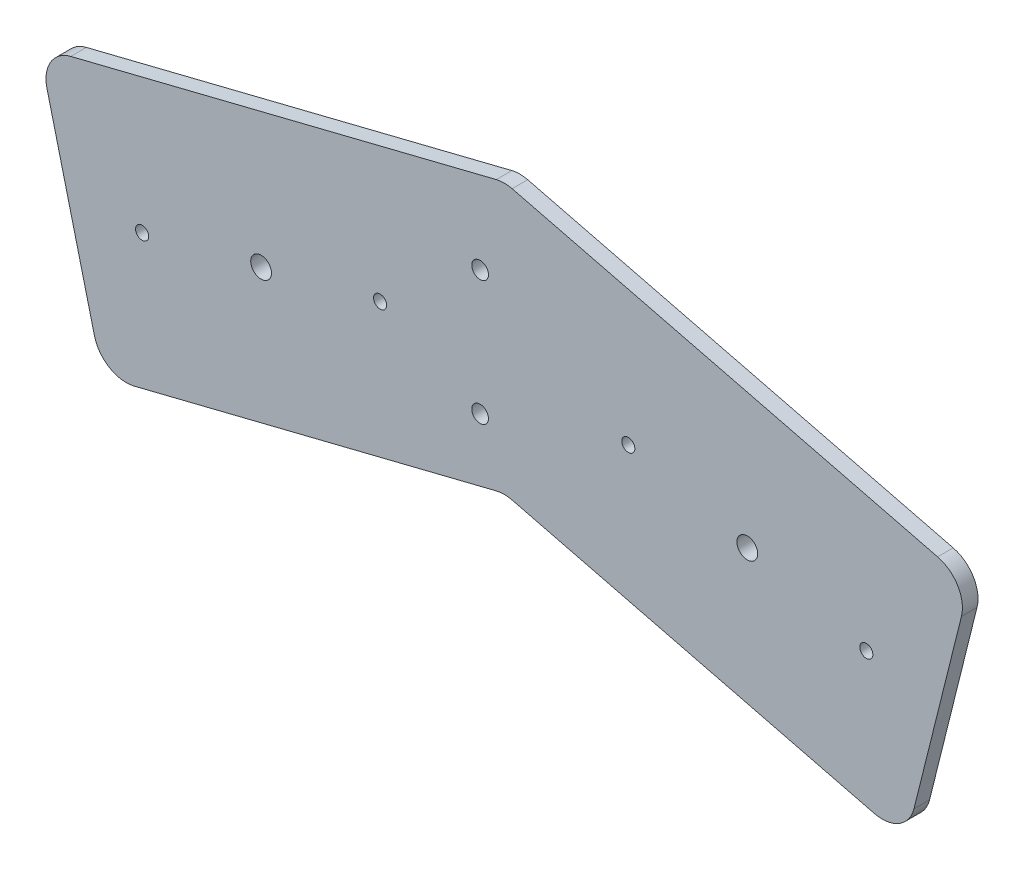
ISO-10303-21;
HEADER;
FILE_DESCRIPTION(('STEP AP214'),'2;1');
FILE_NAME('part.step','',(''),(''),'','','');
FILE_SCHEMA(('AUTOMOTIVE_DESIGN { 1 0 10303 214 1 1 1 1 }'));
ENDSEC;
DATA;
#1=APPLICATION_CONTEXT('core data for automotive mechanical design processes');
#2=APPLICATION_PROTOCOL_DEFINITION('international standard','automotive_design',2000,#1);
#3=PRODUCT_CONTEXT('',#1,'mechanical');
#4=PRODUCT('Part','Part','',(#3));
#5=PRODUCT_RELATED_PRODUCT_CATEGORY('part','',(#4));
#6=PRODUCT_DEFINITION_FORMATION('','',#4);
#7=PRODUCT_DEFINITION_CONTEXT('part definition',#1,'design');
#8=PRODUCT_DEFINITION('design','',#6,#7);
#9=PRODUCT_DEFINITION_SHAPE('','',#8);
#10=(LENGTH_UNIT() NAMED_UNIT(*) SI_UNIT(.MILLI.,.METRE.));
#11=(NAMED_UNIT(*) PLANE_ANGLE_UNIT() SI_UNIT($,.RADIAN.));
#12=(NAMED_UNIT(*) SI_UNIT($,.STERADIAN.) SOLID_ANGLE_UNIT());
#13=UNCERTAINTY_MEASURE_WITH_UNIT(LENGTH_MEASURE(1.E-05),#10,'distance_accuracy_value','');
#14=(GEOMETRIC_REPRESENTATION_CONTEXT(3) GLOBAL_UNCERTAINTY_ASSIGNED_CONTEXT((#13)) GLOBAL_UNIT_ASSIGNED_CONTEXT((#10,
#11,#12)) REPRESENTATION_CONTEXT('',''));
#15=CARTESIAN_POINT('',(0.,0.,0.));
#16=DIRECTION('',(0.,0.,1.));
#17=DIRECTION('',(1.,0.,0.));
#18=AXIS2_PLACEMENT_3D('',#15,#16,#17);
#19=CARTESIAN_POINT('',(0.,-3.86480111006213,-4.7625));
#20=DIRECTION('',(0.,0.,-1.));
#21=DIRECTION('',(-1.,0.,0.));
#22=AXIS2_PLACEMENT_3D('',#19,#20,#21);
#23=PLANE('',#22);
#24=CARTESIAN_POINT('',(-7.366,-20.5695602345621,-4.7625));
#25=DIRECTION('',(0.,0.,1.));
#26=DIRECTION('',(1.,0.,0.));
#27=AXIS2_PLACEMENT_3D('',#24,#25,#26);
#28=CIRCLE('',#27,2.5527);
#29=CARTESIAN_POINT('',(-4.8133,-20.5695602345621,-4.7625));
#30=VERTEX_POINT('',#29);
#31=EDGE_CURVE('E494',#30,#30,#28,.T.);
#32=ORIENTED_EDGE('',*,*,#31,.T.);
#33=EDGE_LOOP('',(#32));
#34=FACE_BOUND('',#33,.T.);
#35=CARTESIAN_POINT('',(-7.366,-58.6695602345621,-4.7625));
#36=DIRECTION('',(0.,0.,1.));
#37=DIRECTION('',(1.,0.,0.));
#38=AXIS2_PLACEMENT_3D('',#35,#36,#37);
#39=CIRCLE('',#38,2.5527);
#40=CARTESIAN_POINT('',(-4.8133,-58.6695602345621,-4.7625));
#41=VERTEX_POINT('',#40);
#42=EDGE_CURVE('E502',#41,#41,#39,.T.);
#43=ORIENTED_EDGE('',*,*,#42,.T.);
#44=EDGE_LOOP('',(#43));
#45=FACE_BOUND('',#44,.T.);
#46=CARTESIAN_POINT('',(-110.721225758861,-62.3891120813645,-4.7625));
#47=DIRECTION('',(0.,0.,1.));
#48=DIRECTION('',(1.,0.,0.));
#49=AXIS2_PLACEMENT_3D('',#46,#47,#48);
#50=CIRCLE('',#49,2.);
#51=CARTESIAN_POINT('',(-108.721225758861,-62.3891120813645,-4.7625));
#52=VERTEX_POINT('',#51);
#53=EDGE_CURVE('E508',#52,#52,#50,.T.);
#54=ORIENTED_EDGE('',*,*,#53,.T.);
#55=EDGE_LOOP('',(#54));
#56=FACE_BOUND('',#55,.T.);
#57=CARTESIAN_POINT('',(-37.9490462881614,-44.2449699113896,-4.7625));
#58=DIRECTION('',(0.,0.,1.));
#59=DIRECTION('',(1.,0.,0.));
#60=AXIS2_PLACEMENT_3D('',#57,#58,#59);
#61=CIRCLE('',#60,2.);
#62=CARTESIAN_POINT('',(-35.9490462881614,-44.2449699113896,-4.7625));
#63=VERTEX_POINT('',#62);
#64=EDGE_CURVE('E514',#63,#63,#61,.T.);
#65=ORIENTED_EDGE('',*,*,#64,.T.);
#66=EDGE_LOOP('',(#65));
#67=FACE_BOUND('',#66,.T.);
#68=CARTESIAN_POINT('',(37.9490462881613,-44.2449699113896,-4.7625));
#69=DIRECTION('',(0.,0.,1.));
#70=DIRECTION('',(1.,0.,0.));
#71=AXIS2_PLACEMENT_3D('',#68,#69,#70);
#72=CIRCLE('',#71,2.);
#73=CARTESIAN_POINT('',(39.9490462881613,-44.2449699113896,-4.7625));
#74=VERTEX_POINT('',#73);
#75=EDGE_CURVE('E520',#74,#74,#72,.T.);
#76=ORIENTED_EDGE('',*,*,#75,.T.);
#77=EDGE_LOOP('',(#76));
#78=FACE_BOUND('',#77,.T.);
#79=CARTESIAN_POINT('',(110.721225758861,-62.3891120813644,-4.7625));
#80=DIRECTION('',(0.,0.,1.));
#81=DIRECTION('',(1.,0.,0.));
#82=AXIS2_PLACEMENT_3D('',#79,#80,#81);
#83=CIRCLE('',#82,2.);
#84=CARTESIAN_POINT('',(112.721225758861,-62.3891120813644,-4.7625));
#85=VERTEX_POINT('',#84);
#86=EDGE_CURVE('E526',#85,#85,#83,.T.);
#87=ORIENTED_EDGE('',*,*,#86,.T.);
#88=EDGE_LOOP('',(#87));
#89=FACE_BOUND('',#88,.T.);
#90=CARTESIAN_POINT('',(-74.3351360235113,-53.317040996377,-4.7625));
#91=DIRECTION('',(0.,0.,1.));
#92=DIRECTION('',(1.,0.,0.));
#93=AXIS2_PLACEMENT_3D('',#90,#91,#92);
#94=CIRCLE('',#93,3.175);
#95=CARTESIAN_POINT('',(-71.1601360235113,-53.317040996377,-4.7625));
#96=VERTEX_POINT('',#95);
#97=EDGE_CURVE('E307',#96,#96,#94,.T.);
#98=ORIENTED_EDGE('',*,*,#97,.T.);
#99=EDGE_LOOP('',(#98));
#100=FACE_BOUND('',#99,.T.);
#101=CARTESIAN_POINT('',(0.,-3.86480111006213,-4.7625));
#102=DIRECTION('',(0.,0.,1.));
#103=DIRECTION('',(-1.,0.,0.));
#104=AXIS2_PLACEMENT_3D('',#101,#102,#103);
#105=CIRCLE('',#104,10.);
#106=CARTESIAN_POINT('',(2.41921895599665,5.83815615269784,-4.7625));
#107=VERTEX_POINT('',#106);
#108=CARTESIAN_POINT('',(-2.41921895599664,5.83815615269785,-4.7625));
#109=VERTEX_POINT('',#108);
#110=EDGE_CURVE('E216',#107,#109,#105,.T.);
#111=ORIENTED_EDGE('',*,*,#110,.F.);
#112=DIRECTION('',(-0.970295726275997,0.241921895599664,0.));
#113=VECTOR('',#112,1.);
#114=CARTESIAN_POINT('',(2.41921895599665,5.83815615269784,-4.7625));
#115=LINE('',#114,#113);
#116=CARTESIAN_POINT('',(132.526798161298,-26.6013067253204,-4.7625));
#117=VERTEX_POINT('',#116);
#118=EDGE_CURVE('E157',#117,#107,#115,.T.);
#119=ORIENTED_EDGE('',*,*,#118,.F.);
#120=CARTESIAN_POINT('',(130.107579205301,-36.3042639880803,-4.7625));
#121=DIRECTION('',(0.,0.,1.));
#122=DIRECTION('',(-1.,0.,0.));
#123=AXIS2_PLACEMENT_3D('',#120,#121,#122);
#124=CIRCLE('',#123,9.99999999999998);
#125=CARTESIAN_POINT('',(139.810536468061,-38.7234829440769,-4.7625));
#126=VERTEX_POINT('',#125);
#127=EDGE_CURVE('E141',#126,#117,#124,.T.);
#128=ORIENTED_EDGE('',*,*,#127,.F.);
#129=DIRECTION('',(0.241921895599665,0.970295726275997,0.));
#130=VECTOR('',#129,1.);
#131=CARTESIAN_POINT('',(139.810536468061,-38.7234829440769,-4.7625));
#132=LINE('',#131,#130);
#133=CARTESIAN_POINT('',(125.295222732081,-96.9412265206368,-4.7625));
#134=VERTEX_POINT('',#133);
#135=EDGE_CURVE('E155',#134,#126,#132,.T.);
#136=ORIENTED_EDGE('',*,*,#135,.F.);
#137=CARTESIAN_POINT('',(115.592265469321,-94.5220075646401,-4.7625));
#138=DIRECTION('',(0.,0.,1.));
#139=DIRECTION('',(-1.,0.,0.));
#140=AXIS2_PLACEMENT_3D('',#137,#138,#139);
#141=CIRCLE('',#140,10.);
#142=CARTESIAN_POINT('',(113.173046513324,-104.2249648274,-4.7625));
#143=VERTEX_POINT('',#142);
#144=EDGE_CURVE('E162',#143,#134,#141,.T.);
#145=ORIENTED_EDGE('',*,*,#144,.F.);
#146=DIRECTION('',(0.970295726275997,-0.241921895599664,0.));
#147=VECTOR('',#146,1.);
#148=CARTESIAN_POINT('',(113.173046513324,-104.2249648274,-4.7625));
#149=LINE('',#148,#147);
#150=CARTESIAN_POINT('',(2.41921895599661,-76.610934195294,-4.7625));
#151=VERTEX_POINT('',#150);
#152=EDGE_CURVE('E165',#151,#143,#149,.T.);
#153=ORIENTED_EDGE('',*,*,#152,.F.);
#154=CARTESIAN_POINT('',(0.,-86.3138914580539,-4.7625));
#155=DIRECTION('',(0.,0.,-1.));
#156=DIRECTION('',(1.,0.,0.));
#157=AXIS2_PLACEMENT_3D('',#154,#155,#156);
#158=CIRCLE('',#157,9.99999999999998);
#159=CARTESIAN_POINT('',(-2.41921895599667,-76.610934195294,-4.7625));
#160=VERTEX_POINT('',#159);
#161=EDGE_CURVE('E338',#160,#151,#158,.T.);
#162=ORIENTED_EDGE('',*,*,#161,.F.);
#163=DIRECTION('',(0.970295726275997,0.241921895599665,0.));
#164=VECTOR('',#163,1.);
#165=CARTESIAN_POINT('',(-2.41921895599667,-76.610934195294,-4.7625));
#166=LINE('',#165,#164);
#167=CARTESIAN_POINT('',(-113.173046513325,-104.2249648274,-4.7625));
#168=VERTEX_POINT('',#167);
#169=EDGE_CURVE('E334',#168,#160,#166,.T.);
#170=ORIENTED_EDGE('',*,*,#169,.F.);
#171=CARTESIAN_POINT('',(-115.592265469321,-94.5220075646403,-4.7625));
#172=DIRECTION('',(0.,0.,1.));
#173=DIRECTION('',(-1.,0.,0.));
#174=AXIS2_PLACEMENT_3D('',#171,#172,#173);
#175=CIRCLE('',#174,9.99999999999999);
#176=CARTESIAN_POINT('',(-125.295222732081,-96.9412265206369,-4.7625));
#177=VERTEX_POINT('',#176);
#178=EDGE_CURVE('E330',#177,#168,#175,.T.);
#179=ORIENTED_EDGE('',*,*,#178,.F.);
#180=DIRECTION('',(0.241921895599665,-0.970295726275997,0.));
#181=VECTOR('',#180,1.);
#182=CARTESIAN_POINT('',(-125.295222732081,-96.9412265206369,-4.7625));
#183=LINE('',#182,#181);
#184=CARTESIAN_POINT('',(-139.810536468061,-38.723482944077,-4.7625));
#185=VERTEX_POINT('',#184);
#186=EDGE_CURVE('E326',#185,#177,#183,.T.);
#187=ORIENTED_EDGE('',*,*,#186,.F.);
#188=CARTESIAN_POINT('',(-130.107579205301,-36.3042639880804,-4.7625));
#189=DIRECTION('',(0.,0.,1.));
#190=DIRECTION('',(1.,0.,0.));
#191=AXIS2_PLACEMENT_3D('',#188,#189,#190);
#192=CIRCLE('',#191,10.);
#193=CARTESIAN_POINT('',(-132.526798161298,-26.6013067253204,-4.7625));
#194=VERTEX_POINT('',#193);
#195=EDGE_CURVE('E322',#194,#185,#192,.T.);
#196=ORIENTED_EDGE('',*,*,#195,.F.);
#197=DIRECTION('',(-0.970295726275997,-0.241921895599665,0.));
#198=VECTOR('',#197,1.);
#199=CARTESIAN_POINT('',(-132.526798161298,-26.6013067253204,-4.7625));
#200=LINE('',#199,#198);
#201=EDGE_CURVE('E319',#109,#194,#200,.T.);
#202=ORIENTED_EDGE('',*,*,#201,.F.);
#203=EDGE_LOOP('',(#111,#119,#128,#136,#145,#153,#162,#170,#179,#187,#196,#202));
#204=FACE_BOUND('',#203,.T.);
#205=CARTESIAN_POINT('',(74.3351360235112,-53.317040996377,-4.7625));
#206=DIRECTION('',(0.,0.,1.));
#207=DIRECTION('',(1.,0.,0.));
#208=AXIS2_PLACEMENT_3D('',#205,#206,#207);
#209=CIRCLE('',#208,3.175);
#210=CARTESIAN_POINT('',(77.5101360235112,-53.317040996377,-4.7625));
#211=VERTEX_POINT('',#210);
#212=EDGE_CURVE('E176',#211,#211,#209,.T.);
#213=ORIENTED_EDGE('',*,*,#212,.T.);
#214=EDGE_LOOP('',(#213));
#215=FACE_BOUND('',#214,.T.);
#216=ADVANCED_FACE('F43',(#34,#45,#56,#67,#78,#89,#100,#204,#215),#23,.T.);
#217=CARTESIAN_POINT('',(0.,-3.86480111006213,-4.7625));
#218=DIRECTION('',(0.,0.,1.));
#219=DIRECTION('',(1.,0.,0.));
#220=AXIS2_PLACEMENT_3D('',#217,#218,#219);
#221=CYLINDRICAL_SURFACE('',#220,10.);
#222=CARTESIAN_POINT('',(0.,-3.86480111006213,0.));
#223=DIRECTION('',(0.,0.,1.));
#224=DIRECTION('',(-1.,0.,0.));
#225=AXIS2_PLACEMENT_3D('',#222,#223,#224);
#226=CIRCLE('',#225,10.);
#227=CARTESIAN_POINT('',(2.41921895599665,5.83815615269784,0.));
#228=VERTEX_POINT('',#227);
#229=CARTESIAN_POINT('',(-2.41921895599664,5.83815615269785,0.));
#230=VERTEX_POINT('',#229);
#231=EDGE_CURVE('E171',#228,#230,#226,.T.);
#232=ORIENTED_EDGE('',*,*,#231,.F.);
#233=DIRECTION('',(0.,0.,1.));
#234=VECTOR('',#233,1.);
#235=CARTESIAN_POINT('',(2.41921895599665,5.83815615269784,-4.7625));
#236=LINE('',#235,#234);
#237=EDGE_CURVE('E11',#107,#228,#236,.T.);
#238=ORIENTED_EDGE('',*,*,#237,.F.);
#239=ORIENTED_EDGE('',*,*,#110,.T.);
#240=DIRECTION('',(0.,0.,1.));
#241=VECTOR('',#240,1.);
#242=CARTESIAN_POINT('',(-2.41921895599664,5.83815615269785,-4.7625));
#243=LINE('',#242,#241);
#244=EDGE_CURVE('E47',#109,#230,#243,.T.);
#245=ORIENTED_EDGE('',*,*,#244,.T.);
#246=EDGE_LOOP('',(#232,#238,#239,#245));
#247=FACE_BOUND('',#246,.T.);
#248=ADVANCED_FACE('F45',(#247),#221,.T.);
#249=CARTESIAN_POINT('',(2.41921895599665,5.83815615269784,-4.7625));
#250=DIRECTION('',(0.241921895599664,0.970295726275997,0.));
#251=DIRECTION('',(-0.970295726275997,0.241921895599664,0.));
#252=AXIS2_PLACEMENT_3D('',#249,#250,#251);
#253=PLANE('',#252);
#254=DIRECTION('',(-0.970295726275997,0.241921895599664,0.));
#255=VECTOR('',#254,1.);
#256=CARTESIAN_POINT('',(2.41921895599665,5.83815615269784,0.));
#257=LINE('',#256,#255);
#258=CARTESIAN_POINT('',(132.526798161298,-26.6013067253204,0.));
#259=VERTEX_POINT('',#258);
#260=EDGE_CURVE('E213',#259,#228,#257,.T.);
#261=ORIENTED_EDGE('',*,*,#260,.F.);
#262=DIRECTION('',(0.,0.,1.));
#263=VECTOR('',#262,1.);
#264=CARTESIAN_POINT('',(132.526798161298,-26.6013067253204,-4.7625));
#265=LINE('',#264,#263);
#266=EDGE_CURVE('E54',#117,#259,#265,.T.);
#267=ORIENTED_EDGE('',*,*,#266,.F.);
#268=ORIENTED_EDGE('',*,*,#118,.T.);
#269=ORIENTED_EDGE('',*,*,#237,.T.);
#270=EDGE_LOOP('',(#261,#267,#268,#269));
#271=FACE_BOUND('',#270,.T.);
#272=ADVANCED_FACE('F246',(#271),#253,.T.);
#273=CARTESIAN_POINT('',(130.107579205301,-36.3042639880803,-4.7625));
#274=DIRECTION('',(0.,0.,1.));
#275=DIRECTION('',(1.,0.,0.));
#276=AXIS2_PLACEMENT_3D('',#273,#274,#275);
#277=CYLINDRICAL_SURFACE('',#276,9.99999999999998);
#278=CARTESIAN_POINT('',(130.107579205301,-36.3042639880803,0.));
#279=DIRECTION('',(0.,0.,1.));
#280=DIRECTION('',(-1.,0.,0.));
#281=AXIS2_PLACEMENT_3D('',#278,#279,#280);
#282=CIRCLE('',#281,9.99999999999998);
#283=CARTESIAN_POINT('',(139.810536468061,-38.7234829440769,0.));
#284=VERTEX_POINT('',#283);
#285=EDGE_CURVE('E143',#284,#259,#282,.T.);
#286=ORIENTED_EDGE('',*,*,#285,.F.);
#287=DIRECTION('',(0.,0.,1.));
#288=VECTOR('',#287,1.);
#289=CARTESIAN_POINT('',(139.810536468061,-38.7234829440769,-4.7625));
#290=LINE('',#289,#288);
#291=EDGE_CURVE('E138',#126,#284,#290,.T.);
#292=ORIENTED_EDGE('',*,*,#291,.F.);
#293=ORIENTED_EDGE('',*,*,#127,.T.);
#294=ORIENTED_EDGE('',*,*,#266,.T.);
#295=EDGE_LOOP('',(#286,#292,#293,#294));
#296=FACE_BOUND('',#295,.T.);
#297=ADVANCED_FACE('F140',(#296),#277,.T.);
#298=CARTESIAN_POINT('',(139.810536468061,-38.7234829440769,-4.7625));
#299=DIRECTION('',(0.970295726275997,-0.241921895599665,0.));
#300=DIRECTION('',(0.241921895599665,0.970295726275997,0.));
#301=AXIS2_PLACEMENT_3D('',#298,#299,#300);
#302=PLANE('',#301);
#303=DIRECTION('',(0.241921895599665,0.970295726275997,0.));
#304=VECTOR('',#303,1.);
#305=CARTESIAN_POINT('',(139.810536468061,-38.7234829440769,0.));
#306=LINE('',#305,#304);
#307=CARTESIAN_POINT('',(125.295222732081,-96.9412265206368,0.));
#308=VERTEX_POINT('',#307);
#309=EDGE_CURVE('E208',#308,#284,#306,.T.);
#310=ORIENTED_EDGE('',*,*,#309,.F.);
#311=DIRECTION('',(0.,0.,1.));
#312=VECTOR('',#311,1.);
#313=CARTESIAN_POINT('',(125.295222732081,-96.9412265206368,-4.7625));
#314=LINE('',#313,#312);
#315=EDGE_CURVE('E149',#134,#308,#314,.T.);
#316=ORIENTED_EDGE('',*,*,#315,.F.);
#317=ORIENTED_EDGE('',*,*,#135,.T.);
#318=ORIENTED_EDGE('',*,*,#291,.T.);
#319=EDGE_LOOP('',(#310,#316,#317,#318));
#320=FACE_BOUND('',#319,.T.);
#321=ADVANCED_FACE('F160',(#320),#302,.T.);
#322=CARTESIAN_POINT('',(115.592265469321,-94.5220075646401,-4.7625));
#323=DIRECTION('',(0.,0.,1.));
#324=DIRECTION('',(1.,0.,0.));
#325=AXIS2_PLACEMENT_3D('',#322,#323,#324);
#326=CYLINDRICAL_SURFACE('',#325,10.);
#327=CARTESIAN_POINT('',(115.592265469321,-94.5220075646401,0.));
#328=DIRECTION('',(0.,0.,1.));
#329=DIRECTION('',(-1.,0.,0.));
#330=AXIS2_PLACEMENT_3D('',#327,#328,#329);
#331=CIRCLE('',#330,10.);
#332=CARTESIAN_POINT('',(113.173046513324,-104.2249648274,0.));
#333=VERTEX_POINT('',#332);
#334=EDGE_CURVE('E204',#333,#308,#331,.T.);
#335=ORIENTED_EDGE('',*,*,#334,.F.);
#336=DIRECTION('',(0.,0.,1.));
#337=VECTOR('',#336,1.);
#338=CARTESIAN_POINT('',(113.173046513324,-104.2249648274,-4.7625));
#339=LINE('',#338,#337);
#340=EDGE_CURVE('E222',#143,#333,#339,.T.);
#341=ORIENTED_EDGE('',*,*,#340,.F.);
#342=ORIENTED_EDGE('',*,*,#144,.T.);
#343=ORIENTED_EDGE('',*,*,#315,.T.);
#344=EDGE_LOOP('',(#335,#341,#342,#343));
#345=FACE_BOUND('',#344,.T.);
#346=ADVANCED_FACE('F367',(#345),#326,.T.);
#347=CARTESIAN_POINT('',(113.173046513324,-104.2249648274,-4.7625));
#348=DIRECTION('',(-0.241921895599664,-0.970295726275997,0.));
#349=DIRECTION('',(0.970295726275997,-0.241921895599664,0.));
#350=AXIS2_PLACEMENT_3D('',#347,#348,#349);
#351=PLANE('',#350);
#352=DIRECTION('',(0.970295726275997,-0.241921895599664,0.));
#353=VECTOR('',#352,1.);
#354=CARTESIAN_POINT('',(113.173046513324,-104.2249648274,0.));
#355=LINE('',#354,#353);
#356=CARTESIAN_POINT('',(2.41921895599661,-76.610934195294,0.));
#357=VERTEX_POINT('',#356);
#358=EDGE_CURVE('E200',#357,#333,#355,.T.);
#359=ORIENTED_EDGE('',*,*,#358,.F.);
#360=DIRECTION('',(0.,0.,1.));
#361=VECTOR('',#360,1.);
#362=CARTESIAN_POINT('',(2.41921895599661,-76.610934195294,-4.7625));
#363=LINE('',#362,#361);
#364=EDGE_CURVE('E225',#151,#357,#363,.T.);
#365=ORIENTED_EDGE('',*,*,#364,.F.);
#366=ORIENTED_EDGE('',*,*,#152,.T.);
#367=ORIENTED_EDGE('',*,*,#340,.T.);
#368=EDGE_LOOP('',(#359,#365,#366,#367));
#369=FACE_BOUND('',#368,.T.);
#370=ADVANCED_FACE('F346',(#369),#351,.T.);
#371=CARTESIAN_POINT('',(0.,-86.3138914580539,-4.7625));
#372=DIRECTION('',(0.,0.,1.));
#373=DIRECTION('',(1.,0.,0.));
#374=AXIS2_PLACEMENT_3D('',#371,#372,#373);
#375=CYLINDRICAL_SURFACE('',#374,9.99999999999998);
#376=CARTESIAN_POINT('',(0.,-86.3138914580539,0.));
#377=DIRECTION('',(0.,0.,-1.));
#378=DIRECTION('',(1.,0.,0.));
#379=AXIS2_PLACEMENT_3D('',#376,#377,#378);
#380=CIRCLE('',#379,9.99999999999998);
#381=CARTESIAN_POINT('',(-2.41921895599667,-76.610934195294,0.));
#382=VERTEX_POINT('',#381);
#383=EDGE_CURVE('E196',#382,#357,#380,.T.);
#384=ORIENTED_EDGE('',*,*,#383,.F.);
#385=DIRECTION('',(0.,0.,1.));
#386=VECTOR('',#385,1.);
#387=CARTESIAN_POINT('',(-2.41921895599667,-76.610934195294,-4.7625));
#388=LINE('',#387,#386);
#389=EDGE_CURVE('E228',#160,#382,#388,.T.);
#390=ORIENTED_EDGE('',*,*,#389,.F.);
#391=ORIENTED_EDGE('',*,*,#161,.T.);
#392=ORIENTED_EDGE('',*,*,#364,.T.);
#393=EDGE_LOOP('',(#384,#390,#391,#392));
#394=FACE_BOUND('',#393,.T.);
#395=ADVANCED_FACE('F352',(#394),#375,.F.);
#396=CARTESIAN_POINT('',(-2.41921895599667,-76.610934195294,-4.7625));
#397=DIRECTION('',(0.241921895599665,-0.970295726275997,0.));
#398=DIRECTION('',(0.970295726275997,0.241921895599665,0.));
#399=AXIS2_PLACEMENT_3D('',#396,#397,#398);
#400=PLANE('',#399);
#401=DIRECTION('',(0.970295726275997,0.241921895599665,0.));
#402=VECTOR('',#401,1.);
#403=CARTESIAN_POINT('',(-2.41921895599667,-76.610934195294,0.));
#404=LINE('',#403,#402);
#405=CARTESIAN_POINT('',(-113.173046513325,-104.2249648274,0.));
#406=VERTEX_POINT('',#405);
#407=EDGE_CURVE('E192',#406,#382,#404,.T.);
#408=ORIENTED_EDGE('',*,*,#407,.F.);
#409=DIRECTION('',(0.,0.,1.));
#410=VECTOR('',#409,1.);
#411=CARTESIAN_POINT('',(-113.173046513325,-104.2249648274,-4.7625));
#412=LINE('',#411,#410);
#413=EDGE_CURVE('E231',#168,#406,#412,.T.);
#414=ORIENTED_EDGE('',*,*,#413,.F.);
#415=ORIENTED_EDGE('',*,*,#169,.T.);
#416=ORIENTED_EDGE('',*,*,#389,.T.);
#417=EDGE_LOOP('',(#408,#414,#415,#416));
#418=FACE_BOUND('',#417,.T.);
#419=ADVANCED_FACE('F355',(#418),#400,.T.);
#420=CARTESIAN_POINT('',(-115.592265469321,-94.5220075646403,-4.7625));
#421=DIRECTION('',(0.,0.,1.));
#422=DIRECTION('',(1.,0.,0.));
#423=AXIS2_PLACEMENT_3D('',#420,#421,#422);
#424=CYLINDRICAL_SURFACE('',#423,9.99999999999999);
#425=CARTESIAN_POINT('',(-115.592265469321,-94.5220075646403,0.));
#426=DIRECTION('',(0.,0.,1.));
#427=DIRECTION('',(-1.,0.,0.));
#428=AXIS2_PLACEMENT_3D('',#425,#426,#427);
#429=CIRCLE('',#428,9.99999999999999);
#430=CARTESIAN_POINT('',(-125.295222732081,-96.9412265206369,0.));
#431=VERTEX_POINT('',#430);
#432=EDGE_CURVE('E188',#431,#406,#429,.T.);
#433=ORIENTED_EDGE('',*,*,#432,.F.);
#434=DIRECTION('',(0.,0.,1.));
#435=VECTOR('',#434,1.);
#436=CARTESIAN_POINT('',(-125.295222732081,-96.9412265206369,-4.7625));
#437=LINE('',#436,#435);
#438=EDGE_CURVE('E234',#177,#431,#437,.T.);
#439=ORIENTED_EDGE('',*,*,#438,.F.);
#440=ORIENTED_EDGE('',*,*,#178,.T.);
#441=ORIENTED_EDGE('',*,*,#413,.T.);
#442=EDGE_LOOP('',(#433,#439,#440,#441));
#443=FACE_BOUND('',#442,.T.);
#444=ADVANCED_FACE('F360',(#443),#424,.T.);
#445=CARTESIAN_POINT('',(-125.295222732081,-96.9412265206369,-4.7625));
#446=DIRECTION('',(-0.970295726275997,-0.241921895599665,0.));
#447=DIRECTION('',(0.241921895599665,-0.970295726275997,0.));
#448=AXIS2_PLACEMENT_3D('',#445,#446,#447);
#449=PLANE('',#448);
#450=DIRECTION('',(0.241921895599665,-0.970295726275997,0.));
#451=VECTOR('',#450,1.);
#452=CARTESIAN_POINT('',(-125.295222732081,-96.9412265206369,0.));
#453=LINE('',#452,#451);
#454=CARTESIAN_POINT('',(-139.810536468061,-38.723482944077,0.));
#455=VERTEX_POINT('',#454);
#456=EDGE_CURVE('E184',#455,#431,#453,.T.);
#457=ORIENTED_EDGE('',*,*,#456,.F.);
#458=DIRECTION('',(0.,0.,1.));
#459=VECTOR('',#458,1.);
#460=CARTESIAN_POINT('',(-139.810536468061,-38.723482944077,-4.7625));
#461=LINE('',#460,#459);
#462=EDGE_CURVE('E237',#185,#455,#461,.T.);
#463=ORIENTED_EDGE('',*,*,#462,.F.);
#464=ORIENTED_EDGE('',*,*,#186,.T.);
#465=ORIENTED_EDGE('',*,*,#438,.T.);
#466=EDGE_LOOP('',(#457,#463,#464,#465));
#467=FACE_BOUND('',#466,.T.);
#468=ADVANCED_FACE('F363',(#467),#449,.T.);
#469=CARTESIAN_POINT('',(-130.107579205301,-36.3042639880804,-4.7625));
#470=DIRECTION('',(0.,0.,1.));
#471=DIRECTION('',(1.,0.,0.));
#472=AXIS2_PLACEMENT_3D('',#469,#470,#471);
#473=CYLINDRICAL_SURFACE('',#472,10.);
#474=CARTESIAN_POINT('',(-130.107579205301,-36.3042639880804,0.));
#475=DIRECTION('',(0.,0.,1.));
#476=DIRECTION('',(1.,0.,0.));
#477=AXIS2_PLACEMENT_3D('',#474,#475,#476);
#478=CIRCLE('',#477,10.);
#479=CARTESIAN_POINT('',(-132.526798161298,-26.6013067253204,0.));
#480=VERTEX_POINT('',#479);
#481=EDGE_CURVE('E180',#480,#455,#478,.T.);
#482=ORIENTED_EDGE('',*,*,#481,.F.);
#483=DIRECTION('',(0.,0.,1.));
#484=VECTOR('',#483,1.);
#485=CARTESIAN_POINT('',(-132.526798161298,-26.6013067253204,-4.7625));
#486=LINE('',#485,#484);
#487=EDGE_CURVE('E239',#194,#480,#486,.T.);
#488=ORIENTED_EDGE('',*,*,#487,.F.);
#489=ORIENTED_EDGE('',*,*,#195,.T.);
#490=ORIENTED_EDGE('',*,*,#462,.T.);
#491=EDGE_LOOP('',(#482,#488,#489,#490));
#492=FACE_BOUND('',#491,.T.);
#493=ADVANCED_FACE('F273',(#492),#473,.T.);
#494=CARTESIAN_POINT('',(-132.526798161298,-26.6013067253204,-4.7625));
#495=DIRECTION('',(-0.241921895599665,0.970295726275997,0.));
#496=DIRECTION('',(-0.970295726275997,-0.241921895599665,0.));
#497=AXIS2_PLACEMENT_3D('',#494,#495,#496);
#498=PLANE('',#497);
#499=DIRECTION('',(-0.970295726275997,-0.241921895599665,0.));
#500=VECTOR('',#499,1.);
#501=CARTESIAN_POINT('',(-132.526798161298,-26.6013067253204,0.));
#502=LINE('',#501,#500);
#503=EDGE_CURVE('E175',#230,#480,#502,.T.);
#504=ORIENTED_EDGE('',*,*,#503,.F.);
#505=ORIENTED_EDGE('',*,*,#244,.F.);
#506=ORIENTED_EDGE('',*,*,#201,.T.);
#507=ORIENTED_EDGE('',*,*,#487,.T.);
#508=EDGE_LOOP('',(#504,#505,#506,#507));
#509=FACE_BOUND('',#508,.T.);
#510=ADVANCED_FACE('F243',(#509),#498,.T.);
#511=CARTESIAN_POINT('',(0.,-3.86480111006213,0.));
#512=DIRECTION('',(0.,0.,-1.));
#513=DIRECTION('',(-1.,0.,0.));
#514=AXIS2_PLACEMENT_3D('',#511,#512,#513);
#515=PLANE('',#514);
#516=CARTESIAN_POINT('',(-7.366,-20.5695602345621,0.));
#517=DIRECTION('',(0.,0.,1.));
#518=DIRECTION('',(1.,0.,0.));
#519=AXIS2_PLACEMENT_3D('',#516,#517,#518);
#520=CIRCLE('',#519,2.5527);
#521=CARTESIAN_POINT('',(-4.8133,-20.5695602345621,0.));
#522=VERTEX_POINT('',#521);
#523=EDGE_CURVE('E277',#522,#522,#520,.T.);
#524=ORIENTED_EDGE('',*,*,#523,.F.);
#525=EDGE_LOOP('',(#524));
#526=FACE_BOUND('',#525,.T.);
#527=CARTESIAN_POINT('',(-7.366,-58.6695602345621,0.));
#528=DIRECTION('',(0.,0.,1.));
#529=DIRECTION('',(1.,0.,0.));
#530=AXIS2_PLACEMENT_3D('',#527,#528,#529);
#531=CIRCLE('',#530,2.5527);
#532=CARTESIAN_POINT('',(-4.8133,-58.6695602345621,0.));
#533=VERTEX_POINT('',#532);
#534=EDGE_CURVE('E281',#533,#533,#531,.T.);
#535=ORIENTED_EDGE('',*,*,#534,.F.);
#536=EDGE_LOOP('',(#535));
#537=FACE_BOUND('',#536,.T.);
#538=CARTESIAN_POINT('',(-110.721225758861,-62.3891120813645,0.));
#539=DIRECTION('',(0.,0.,1.));
#540=DIRECTION('',(1.,0.,0.));
#541=AXIS2_PLACEMENT_3D('',#538,#539,#540);
#542=CIRCLE('',#541,2.);
#543=CARTESIAN_POINT('',(-108.721225758861,-62.3891120813645,0.));
#544=VERTEX_POINT('',#543);
#545=EDGE_CURVE('E285',#544,#544,#542,.T.);
#546=ORIENTED_EDGE('',*,*,#545,.F.);
#547=EDGE_LOOP('',(#546));
#548=FACE_BOUND('',#547,.T.);
#549=CARTESIAN_POINT('',(-37.9490462881614,-44.2449699113896,0.));
#550=DIRECTION('',(0.,0.,1.));
#551=DIRECTION('',(1.,0.,0.));
#552=AXIS2_PLACEMENT_3D('',#549,#550,#551);
#553=CIRCLE('',#552,2.);
#554=CARTESIAN_POINT('',(-35.9490462881614,-44.2449699113896,0.));
#555=VERTEX_POINT('',#554);
#556=EDGE_CURVE('E289',#555,#555,#553,.T.);
#557=ORIENTED_EDGE('',*,*,#556,.F.);
#558=EDGE_LOOP('',(#557));
#559=FACE_BOUND('',#558,.T.);
#560=CARTESIAN_POINT('',(37.9490462881613,-44.2449699113896,0.));
#561=DIRECTION('',(0.,0.,1.));
#562=DIRECTION('',(1.,0.,0.));
#563=AXIS2_PLACEMENT_3D('',#560,#561,#562);
#564=CIRCLE('',#563,2.);
#565=CARTESIAN_POINT('',(39.9490462881613,-44.2449699113896,0.));
#566=VERTEX_POINT('',#565);
#567=EDGE_CURVE('E293',#566,#566,#564,.T.);
#568=ORIENTED_EDGE('',*,*,#567,.F.);
#569=EDGE_LOOP('',(#568));
#570=FACE_BOUND('',#569,.T.);
#571=CARTESIAN_POINT('',(110.721225758861,-62.3891120813644,0.));
#572=DIRECTION('',(0.,0.,1.));
#573=DIRECTION('',(1.,0.,0.));
#574=AXIS2_PLACEMENT_3D('',#571,#572,#573);
#575=CIRCLE('',#574,2.);
#576=CARTESIAN_POINT('',(112.721225758861,-62.3891120813644,0.));
#577=VERTEX_POINT('',#576);
#578=EDGE_CURVE('E297',#577,#577,#575,.T.);
#579=ORIENTED_EDGE('',*,*,#578,.F.);
#580=EDGE_LOOP('',(#579));
#581=FACE_BOUND('',#580,.T.);
#582=CARTESIAN_POINT('',(-74.3351360235113,-53.317040996377,0.));
#583=DIRECTION('',(0.,0.,1.));
#584=DIRECTION('',(1.,0.,0.));
#585=AXIS2_PLACEMENT_3D('',#582,#583,#584);
#586=CIRCLE('',#585,3.17499999999998);
#587=CARTESIAN_POINT('',(-71.1601360235113,-53.317040996377,0.));
#588=VERTEX_POINT('',#587);
#589=EDGE_CURVE('E301',#588,#588,#586,.T.);
#590=ORIENTED_EDGE('',*,*,#589,.F.);
#591=EDGE_LOOP('',(#590));
#592=FACE_BOUND('',#591,.T.);
#593=CARTESIAN_POINT('',(74.3351360235112,-53.317040996377,0.));
#594=DIRECTION('',(0.,0.,1.));
#595=DIRECTION('',(1.,0.,0.));
#596=AXIS2_PLACEMENT_3D('',#593,#594,#595);
#597=CIRCLE('',#596,3.17499999999998);
#598=CARTESIAN_POINT('',(77.5101360235112,-53.317040996377,0.));
#599=VERTEX_POINT('',#598);
#600=EDGE_CURVE('E304',#599,#599,#597,.T.);
#601=ORIENTED_EDGE('',*,*,#600,.F.);
#602=EDGE_LOOP('',(#601));
#603=FACE_BOUND('',#602,.T.);
#604=ORIENTED_EDGE('',*,*,#231,.T.);
#605=ORIENTED_EDGE('',*,*,#503,.T.);
#606=ORIENTED_EDGE('',*,*,#481,.T.);
#607=ORIENTED_EDGE('',*,*,#456,.T.);
#608=ORIENTED_EDGE('',*,*,#432,.T.);
#609=ORIENTED_EDGE('',*,*,#407,.T.);
#610=ORIENTED_EDGE('',*,*,#383,.T.);
#611=ORIENTED_EDGE('',*,*,#358,.T.);
#612=ORIENTED_EDGE('',*,*,#334,.T.);
#613=ORIENTED_EDGE('',*,*,#309,.T.);
#614=ORIENTED_EDGE('',*,*,#285,.T.);
#615=ORIENTED_EDGE('',*,*,#260,.T.);
#616=EDGE_LOOP('',(#604,#605,#606,#607,#608,#609,#610,#611,#612,#613,#614,#615));
#617=FACE_BOUND('',#616,.T.);
#618=ADVANCED_FACE('F245',(#526,#537,#548,#559,#570,#581,#592,#603,#617),#515,.F.);
#619=CARTESIAN_POINT('',(74.3351360235112,-53.317040996377,0.));
#620=DIRECTION('',(0.,0.,1.));
#621=DIRECTION('',(1.,0.,0.));
#622=AXIS2_PLACEMENT_3D('',#619,#620,#621);
#623=CYLINDRICAL_SURFACE('',#622,3.17499999999999);
#624=ORIENTED_EDGE('',*,*,#212,.F.);
#625=EDGE_LOOP('',(#624));
#626=FACE_BOUND('',#625,.T.);
#627=ORIENTED_EDGE('',*,*,#600,.T.);
#628=EDGE_LOOP('',(#627));
#629=FACE_BOUND('',#628,.T.);
#630=ADVANCED_FACE('F263',(#626,#629),#623,.F.);
#631=CARTESIAN_POINT('',(-74.3351360235113,-53.317040996377,0.));
#632=DIRECTION('',(0.,0.,1.));
#633=DIRECTION('',(1.,0.,0.));
#634=AXIS2_PLACEMENT_3D('',#631,#632,#633);
#635=CYLINDRICAL_SURFACE('',#634,3.17499999999999);
#636=ORIENTED_EDGE('',*,*,#97,.F.);
#637=EDGE_LOOP('',(#636));
#638=FACE_BOUND('',#637,.T.);
#639=ORIENTED_EDGE('',*,*,#589,.T.);
#640=EDGE_LOOP('',(#639));
#641=FACE_BOUND('',#640,.T.);
#642=ADVANCED_FACE('F271',(#638,#641),#635,.F.);
#643=CARTESIAN_POINT('',(110.721225758861,-62.3891120813644,0.));
#644=DIRECTION('',(0.,0.,1.));
#645=DIRECTION('',(1.,0.,0.));
#646=AXIS2_PLACEMENT_3D('',#643,#644,#645);
#647=CYLINDRICAL_SURFACE('',#646,2.);
#648=ORIENTED_EDGE('',*,*,#86,.F.);
#649=EDGE_LOOP('',(#648));
#650=FACE_BOUND('',#649,.T.);
#651=ORIENTED_EDGE('',*,*,#578,.T.);
#652=EDGE_LOOP('',(#651));
#653=FACE_BOUND('',#652,.T.);
#654=ADVANCED_FACE('F411',(#650,#653),#647,.F.);
#655=CARTESIAN_POINT('',(37.9490462881613,-44.2449699113896,0.));
#656=DIRECTION('',(0.,0.,1.));
#657=DIRECTION('',(1.,0.,0.));
#658=AXIS2_PLACEMENT_3D('',#655,#656,#657);
#659=CYLINDRICAL_SURFACE('',#658,2.);
#660=ORIENTED_EDGE('',*,*,#75,.F.);
#661=EDGE_LOOP('',(#660));
#662=FACE_BOUND('',#661,.T.);
#663=ORIENTED_EDGE('',*,*,#567,.T.);
#664=EDGE_LOOP('',(#663));
#665=FACE_BOUND('',#664,.T.);
#666=ADVANCED_FACE('F420',(#662,#665),#659,.F.);
#667=CARTESIAN_POINT('',(-37.9490462881614,-44.2449699113896,0.));
#668=DIRECTION('',(0.,0.,1.));
#669=DIRECTION('',(1.,0.,0.));
#670=AXIS2_PLACEMENT_3D('',#667,#668,#669);
#671=CYLINDRICAL_SURFACE('',#670,2.);
#672=ORIENTED_EDGE('',*,*,#64,.F.);
#673=EDGE_LOOP('',(#672));
#674=FACE_BOUND('',#673,.T.);
#675=ORIENTED_EDGE('',*,*,#556,.T.);
#676=EDGE_LOOP('',(#675));
#677=FACE_BOUND('',#676,.T.);
#678=ADVANCED_FACE('F430',(#674,#677),#671,.F.);
#679=CARTESIAN_POINT('',(-110.721225758861,-62.3891120813645,0.));
#680=DIRECTION('',(0.,0.,1.));
#681=DIRECTION('',(1.,0.,0.));
#682=AXIS2_PLACEMENT_3D('',#679,#680,#681);
#683=CYLINDRICAL_SURFACE('',#682,2.);
#684=ORIENTED_EDGE('',*,*,#53,.F.);
#685=EDGE_LOOP('',(#684));
#686=FACE_BOUND('',#685,.T.);
#687=ORIENTED_EDGE('',*,*,#545,.T.);
#688=EDGE_LOOP('',(#687));
#689=FACE_BOUND('',#688,.T.);
#690=ADVANCED_FACE('F440',(#686,#689),#683,.F.);
#691=CARTESIAN_POINT('',(-7.366,-58.6695602345621,0.));
#692=DIRECTION('',(0.,0.,1.));
#693=DIRECTION('',(1.,0.,0.));
#694=AXIS2_PLACEMENT_3D('',#691,#692,#693);
#695=CYLINDRICAL_SURFACE('',#694,2.5527);
#696=ORIENTED_EDGE('',*,*,#42,.F.);
#697=EDGE_LOOP('',(#696));
#698=FACE_BOUND('',#697,.T.);
#699=ORIENTED_EDGE('',*,*,#534,.T.);
#700=EDGE_LOOP('',(#699));
#701=FACE_BOUND('',#700,.T.);
#702=ADVANCED_FACE('F449',(#698,#701),#695,.F.);
#703=CARTESIAN_POINT('',(-7.366,-20.5695602345621,0.));
#704=DIRECTION('',(0.,0.,1.));
#705=DIRECTION('',(1.,0.,0.));
#706=AXIS2_PLACEMENT_3D('',#703,#704,#705);
#707=CYLINDRICAL_SURFACE('',#706,2.5527);
#708=ORIENTED_EDGE('',*,*,#31,.F.);
#709=EDGE_LOOP('',(#708));
#710=FACE_BOUND('',#709,.T.);
#711=ORIENTED_EDGE('',*,*,#523,.T.);
#712=EDGE_LOOP('',(#711));
#713=FACE_BOUND('',#712,.T.);
#714=ADVANCED_FACE('F472',(#710,#713),#707,.F.);
#715=CLOSED_SHELL('',(#216,#248,#272,#297,#321,#346,#370,#395,#419,#444,#468,#493,#510,#618,
#630,#642,#654,#666,#678,#690,#702,#714));
#716=MANIFOLD_SOLID_BREP('B2',#715);
#717=ADVANCED_BREP_SHAPE_REPRESENTATION('',(#18,#716),#14);
#718=SHAPE_DEFINITION_REPRESENTATION(#9,#717);
ENDSEC;
END-ISO-10303-21;
